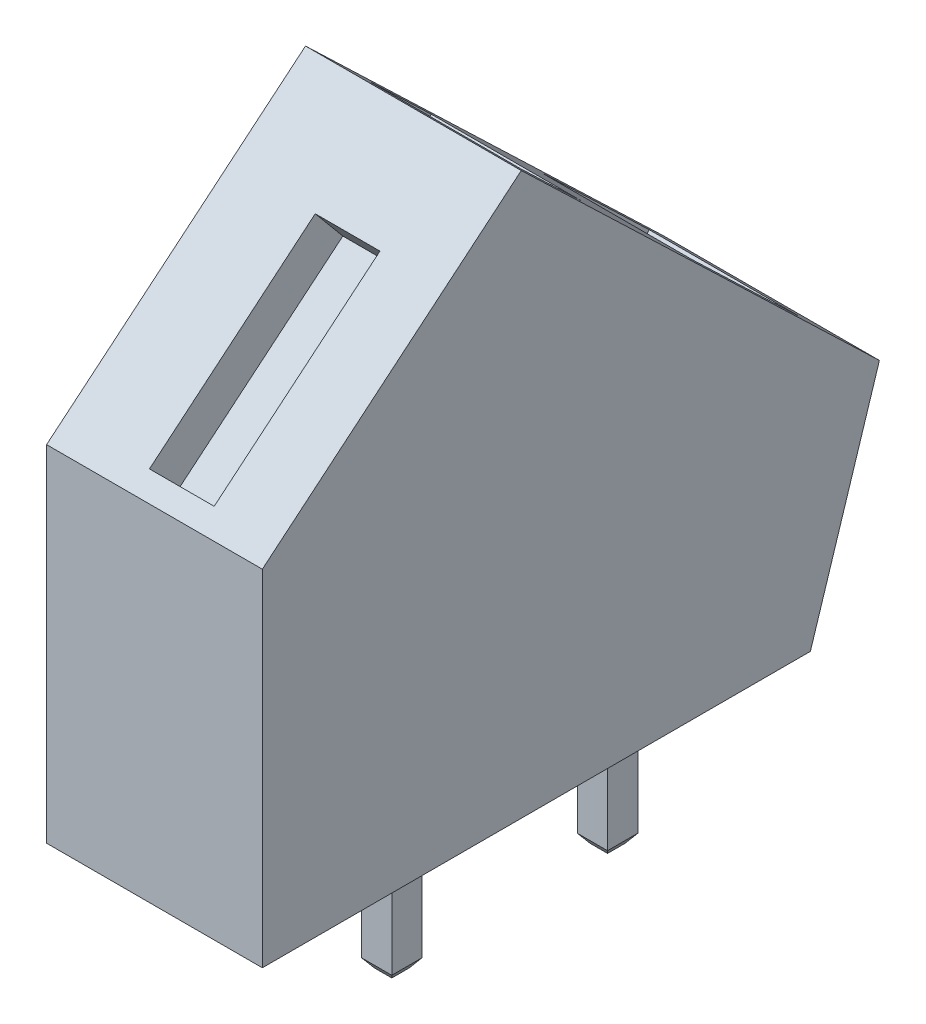
ISO-10303-21;
HEADER;
FILE_DESCRIPTION(('STEP AP214'),'2;1');
FILE_NAME('part.step','',(''),(''),'','','');
FILE_SCHEMA(('AUTOMOTIVE_DESIGN { 1 0 10303 214 1 1 1 1 }'));
ENDSEC;
DATA;
#1=APPLICATION_CONTEXT('core data for automotive mechanical design processes');
#2=APPLICATION_PROTOCOL_DEFINITION('international standard','automotive_design',2000,#1);
#3=PRODUCT_CONTEXT('',#1,'mechanical');
#4=PRODUCT('Part','Part','',(#3));
#5=PRODUCT_RELATED_PRODUCT_CATEGORY('part','',(#4));
#6=PRODUCT_DEFINITION_FORMATION('','',#4);
#7=PRODUCT_DEFINITION_CONTEXT('part definition',#1,'design');
#8=PRODUCT_DEFINITION('design','',#6,#7);
#9=PRODUCT_DEFINITION_SHAPE('','',#8);
#10=(LENGTH_UNIT() NAMED_UNIT(*) SI_UNIT(.MILLI.,.METRE.));
#11=(NAMED_UNIT(*) PLANE_ANGLE_UNIT() SI_UNIT($,.RADIAN.));
#12=(NAMED_UNIT(*) SI_UNIT($,.STERADIAN.) SOLID_ANGLE_UNIT());
#13=UNCERTAINTY_MEASURE_WITH_UNIT(LENGTH_MEASURE(1.E-05),#10,'distance_accuracy_value','');
#14=(GEOMETRIC_REPRESENTATION_CONTEXT(3) GLOBAL_UNCERTAINTY_ASSIGNED_CONTEXT((#13)) GLOBAL_UNIT_ASSIGNED_CONTEXT((#10,
#11,#12)) REPRESENTATION_CONTEXT('',''));
#15=CARTESIAN_POINT('',(0.,0.,0.));
#16=DIRECTION('',(0.,0.,1.));
#17=DIRECTION('',(1.,0.,0.));
#18=AXIS2_PLACEMENT_3D('',#15,#16,#17);
#19=CARTESIAN_POINT('',(2.5,0.,6.35));
#20=DIRECTION('',(0.,1.,0.));
#21=DIRECTION('',(0.,0.,1.));
#22=AXIS2_PLACEMENT_3D('',#19,#20,#21);
#23=PLANE('',#22);
#24=DIRECTION('',(0.,0.,-1.));
#25=VECTOR('',#24,1.);
#26=CARTESIAN_POINT('',(0.15,0.,1.7));
#27=LINE('',#26,#25);
#28=CARTESIAN_POINT('',(0.15,0.,1.7));
#29=VERTEX_POINT('',#28);
#30=CARTESIAN_POINT('',(0.15,0.,1.));
#31=VERTEX_POINT('',#30);
#32=EDGE_CURVE('E261',#29,#31,#27,.T.);
#33=ORIENTED_EDGE('',*,*,#32,.F.);
#34=DIRECTION('',(-1.,0.,0.));
#35=VECTOR('',#34,1.);
#36=CARTESIAN_POINT('',(0.85,0.,1.7));
#37=LINE('',#36,#35);
#38=CARTESIAN_POINT('',(0.85,0.,1.7));
#39=VERTEX_POINT('',#38);
#40=EDGE_CURVE('E270',#39,#29,#37,.T.);
#41=ORIENTED_EDGE('',*,*,#40,.F.);
#42=DIRECTION('',(0.,0.,1.));
#43=VECTOR('',#42,1.);
#44=CARTESIAN_POINT('',(0.85,0.,1.7));
#45=LINE('',#44,#43);
#46=CARTESIAN_POINT('',(0.85,0.,0.999999999999988));
#47=VERTEX_POINT('',#46);
#48=EDGE_CURVE('E267',#47,#39,#45,.T.);
#49=ORIENTED_EDGE('',*,*,#48,.F.);
#50=DIRECTION('',(1.,0.,0.));
#51=VECTOR('',#50,1.);
#52=CARTESIAN_POINT('',(0.85,0.,1.));
#53=LINE('',#52,#51);
#54=EDGE_CURVE('E264',#31,#47,#53,.T.);
#55=ORIENTED_EDGE('',*,*,#54,.F.);
#56=EDGE_LOOP('',(#33,#41,#49,#55));
#57=FACE_BOUND('',#56,.T.);
#58=DIRECTION('',(0.,0.,-1.));
#59=VECTOR('',#58,1.);
#60=CARTESIAN_POINT('',(-2.5,0.,6.35));
#61=LINE('',#60,#59);
#62=CARTESIAN_POINT('',(-2.5,0.,6.35));
#63=VERTEX_POINT('',#62);
#64=CARTESIAN_POINT('',(-2.5,0.,-6.35));
#65=VERTEX_POINT('',#64);
#66=EDGE_CURVE('E393',#63,#65,#61,.T.);
#67=ORIENTED_EDGE('',*,*,#66,.T.);
#68=DIRECTION('',(-1.,0.,0.));
#69=VECTOR('',#68,1.);
#70=CARTESIAN_POINT('',(2.5,0.,-6.35));
#71=LINE('',#70,#69);
#72=CARTESIAN_POINT('',(2.5,0.,-6.35));
#73=VERTEX_POINT('',#72);
#74=EDGE_CURVE('E408',#73,#65,#71,.T.);
#75=ORIENTED_EDGE('',*,*,#74,.F.);
#76=DIRECTION('',(0.,0.,-1.));
#77=VECTOR('',#76,1.);
#78=CARTESIAN_POINT('',(2.5,0.,6.35));
#79=LINE('',#78,#77);
#80=CARTESIAN_POINT('',(2.5,0.,6.35));
#81=VERTEX_POINT('',#80);
#82=EDGE_CURVE('E381',#81,#73,#79,.T.);
#83=ORIENTED_EDGE('',*,*,#82,.F.);
#84=DIRECTION('',(-1.,0.,0.));
#85=VECTOR('',#84,1.);
#86=CARTESIAN_POINT('',(2.5,0.,6.35));
#87=LINE('',#86,#85);
#88=EDGE_CURVE('E411',#81,#63,#87,.T.);
#89=ORIENTED_EDGE('',*,*,#88,.T.);
#90=EDGE_LOOP('',(#67,#75,#83,#89));
#91=FACE_BOUND('',#90,.T.);
#92=DIRECTION('',(0.,0.,-1.));
#93=VECTOR('',#92,1.);
#94=CARTESIAN_POINT('',(0.15,0.,-3.3));
#95=LINE('',#94,#93);
#96=CARTESIAN_POINT('',(0.15,0.,-3.3));
#97=VERTEX_POINT('',#96);
#98=CARTESIAN_POINT('',(0.15,0.,-4.));
#99=VERTEX_POINT('',#98);
#100=EDGE_CURVE('E231',#97,#99,#95,.T.);
#101=ORIENTED_EDGE('',*,*,#100,.F.);
#102=DIRECTION('',(-1.,0.,0.));
#103=VECTOR('',#102,1.);
#104=CARTESIAN_POINT('',(0.85,0.,-3.3));
#105=LINE('',#104,#103);
#106=CARTESIAN_POINT('',(0.85,0.,-3.3));
#107=VERTEX_POINT('',#106);
#108=EDGE_CURVE('E238',#107,#97,#105,.T.);
#109=ORIENTED_EDGE('',*,*,#108,.F.);
#110=DIRECTION('',(0.,0.,1.));
#111=VECTOR('',#110,1.);
#112=CARTESIAN_POINT('',(0.85,0.,-3.3));
#113=LINE('',#112,#111);
#114=CARTESIAN_POINT('',(0.85,0.,-4.00000000000001));
#115=VERTEX_POINT('',#114);
#116=EDGE_CURVE('E251',#115,#107,#113,.T.);
#117=ORIENTED_EDGE('',*,*,#116,.F.);
#118=DIRECTION('',(1.,0.,0.));
#119=VECTOR('',#118,1.);
#120=CARTESIAN_POINT('',(0.85,0.,-4.));
#121=LINE('',#120,#119);
#122=EDGE_CURVE('E246',#99,#115,#121,.T.);
#123=ORIENTED_EDGE('',*,*,#122,.F.);
#124=EDGE_LOOP('',(#101,#109,#117,#123));
#125=FACE_BOUND('',#124,.T.);
#126=ADVANCED_FACE('F35',(#57,#91,#125),#23,.F.);
#127=CARTESIAN_POINT('',(2.5,0.,6.35));
#128=DIRECTION('',(0.,0.,-1.));
#129=DIRECTION('',(0.,1.,0.));
#130=AXIS2_PLACEMENT_3D('',#127,#128,#129);
#131=PLANE('',#130);
#132=DIRECTION('',(0.,-1.,0.));
#133=VECTOR('',#132,1.);
#134=CARTESIAN_POINT('',(-2.5,0.,6.35));
#135=LINE('',#134,#133);
#136=CARTESIAN_POINT('',(-2.5,7.99999999999998,6.35000000000003));
#137=VERTEX_POINT('',#136);
#138=EDGE_CURVE('E341',#137,#63,#135,.T.);
#139=ORIENTED_EDGE('',*,*,#138,.T.);
#140=ORIENTED_EDGE('',*,*,#88,.F.);
#141=DIRECTION('',(0.,-1.,0.));
#142=VECTOR('',#141,1.);
#143=CARTESIAN_POINT('',(2.5,0.,6.35));
#144=LINE('',#143,#142);
#145=CARTESIAN_POINT('',(2.5,7.99999999999998,6.35000000000003));
#146=VERTEX_POINT('',#145);
#147=EDGE_CURVE('E378',#146,#81,#144,.T.);
#148=ORIENTED_EDGE('',*,*,#147,.F.);
#149=DIRECTION('',(-1.,0.,0.));
#150=VECTOR('',#149,1.);
#151=CARTESIAN_POINT('',(2.5,7.99999999999998,6.35000000000003));
#152=LINE('',#151,#150);
#153=EDGE_CURVE('E390',#146,#137,#152,.T.);
#154=ORIENTED_EDGE('',*,*,#153,.T.);
#155=EDGE_LOOP('',(#139,#140,#148,#154));
#156=FACE_BOUND('',#155,.T.);
#157=ADVANCED_FACE('F497',(#156),#131,.F.);
#158=CARTESIAN_POINT('',(2.5,5.04010050314707,-7.94999999999999));
#159=DIRECTION('',(0.,0.302573651175948,0.953126007206841));
#160=DIRECTION('',(0.,-0.953126007206841,0.302573651175948));
#161=AXIS2_PLACEMENT_3D('',#158,#159,#160);
#162=PLANE('',#161);
#163=DIRECTION('',(0.,0.953126007206841,-0.302573651175948));
#164=VECTOR('',#163,1.);
#165=CARTESIAN_POINT('',(-2.5,5.04010050314707,-7.94999999999999));
#166=LINE('',#165,#164);
#167=CARTESIAN_POINT('',(-2.5,5.04010050314707,-7.94999999999999));
#168=VERTEX_POINT('',#167);
#169=EDGE_CURVE('E395',#65,#168,#166,.T.);
#170=ORIENTED_EDGE('',*,*,#169,.T.);
#171=DIRECTION('',(-1.,0.,0.));
#172=VECTOR('',#171,1.);
#173=CARTESIAN_POINT('',(2.5,5.04010050314707,-7.94999999999999));
#174=LINE('',#173,#172);
#175=CARTESIAN_POINT('',(2.5,5.04010050314707,-7.94999999999999));
#176=VERTEX_POINT('',#175);
#177=EDGE_CURVE('E405',#176,#168,#174,.T.);
#178=ORIENTED_EDGE('',*,*,#177,.F.);
#179=DIRECTION('',(0.,0.953126007206841,-0.302573651175948));
#180=VECTOR('',#179,1.);
#181=CARTESIAN_POINT('',(2.5,5.04010050314707,-7.94999999999999));
#182=LINE('',#181,#180);
#183=EDGE_CURVE('E384',#73,#176,#182,.T.);
#184=ORIENTED_EDGE('',*,*,#183,.F.);
#185=ORIENTED_EDGE('',*,*,#74,.T.);
#186=EDGE_LOOP('',(#170,#178,#184,#185));
#187=FACE_BOUND('',#186,.T.);
#188=ADVANCED_FACE('F503',(#187),#162,.F.);
#189=CARTESIAN_POINT('',(2.5,13.,0.350000000000045));
#190=DIRECTION('',(0.,-0.721739130434785,0.692165173639385));
#191=DIRECTION('',(0.,-0.692165173639385,-0.721739130434785));
#192=AXIS2_PLACEMENT_3D('',#189,#190,#191);
#193=PLANE('',#192);
#194=DIRECTION('',(1.,0.,0.));
#195=VECTOR('',#194,1.);
#196=CARTESIAN_POINT('',(1.75,12.3078348263606,-0.371739130434742));
#197=LINE('',#196,#195);
#198=CARTESIAN_POINT('',(-1.75,12.3078348263606,-0.371739130434738));
#199=VERTEX_POINT('',#198);
#200=CARTESIAN_POINT('',(1.75,12.3078348263606,-0.371739130434742));
#201=VERTEX_POINT('',#200);
#202=EDGE_CURVE('E330',#199,#201,#197,.T.);
#203=ORIENTED_EDGE('',*,*,#202,.F.);
#204=DIRECTION('',(0.,0.692165173639385,0.721739130434785));
#205=VECTOR('',#204,1.);
#206=CARTESIAN_POINT('',(-1.75,12.3078348263606,-0.371739130434742));
#207=LINE('',#206,#205);
#208=CARTESIAN_POINT('',(-1.75,10.9235044790818,-1.81521739130431));
#209=VERTEX_POINT('',#208);
#210=EDGE_CURVE('E328',#209,#199,#207,.T.);
#211=ORIENTED_EDGE('',*,*,#210,.F.);
#212=DIRECTION('',(-1.,0.,0.));
#213=VECTOR('',#212,1.);
#214=CARTESIAN_POINT('',(1.75,10.9235044790818,-1.81521739130431));
#215=LINE('',#214,#213);
#216=CARTESIAN_POINT('',(1.75,10.9235044790818,-1.81521739130431));
#217=VERTEX_POINT('',#216);
#218=EDGE_CURVE('E318',#217,#209,#215,.T.);
#219=ORIENTED_EDGE('',*,*,#218,.F.);
#220=DIRECTION('',(0.,-0.692165173639385,-0.721739130434785));
#221=VECTOR('',#220,1.);
#222=CARTESIAN_POINT('',(1.75,12.3078348263606,-0.371739130434742));
#223=LINE('',#222,#221);
#224=EDGE_CURVE('E334',#201,#217,#223,.T.);
#225=ORIENTED_EDGE('',*,*,#224,.F.);
#226=EDGE_LOOP('',(#203,#211,#219,#225));
#227=FACE_BOUND('',#226,.T.);
#228=DIRECTION('',(-1.,0.,0.));
#229=VECTOR('',#228,1.);
#230=CARTESIAN_POINT('',(-1.75,6.07834826360615,-6.86739130434781));
#231=LINE('',#230,#229);
#232=CARTESIAN_POINT('',(1.75,6.07834826360615,-6.86739130434781));
#233=VERTEX_POINT('',#232);
#234=CARTESIAN_POINT('',(-1.75,6.07834826360615,-6.86739130434781));
#235=VERTEX_POINT('',#234);
#236=EDGE_CURVE('E363',#233,#235,#231,.T.);
#237=ORIENTED_EDGE('',*,*,#236,.F.);
#238=DIRECTION('',(0.,-0.692165173639385,-0.721739130434785));
#239=VECTOR('',#238,1.);
#240=CARTESIAN_POINT('',(1.75,6.07834826360615,-6.86739130434781));
#241=LINE('',#240,#239);
#242=CARTESIAN_POINT('',(1.75,8.500926371344,-4.34130434782606));
#243=VERTEX_POINT('',#242);
#244=EDGE_CURVE('E307',#243,#233,#241,.T.);
#245=ORIENTED_EDGE('',*,*,#244,.F.);
#246=DIRECTION('',(1.,0.,0.));
#247=VECTOR('',#246,1.);
#248=CARTESIAN_POINT('',(-1.75,8.500926371344,-4.34130434782606));
#249=LINE('',#248,#247);
#250=CARTESIAN_POINT('',(-1.75,8.500926371344,-4.34130434782606));
#251=VERTEX_POINT('',#250);
#252=EDGE_CURVE('E352',#251,#243,#249,.T.);
#253=ORIENTED_EDGE('',*,*,#252,.F.);
#254=DIRECTION('',(0.,0.692165173639385,0.721739130434785));
#255=VECTOR('',#254,1.);
#256=CARTESIAN_POINT('',(-1.75,6.07834826360615,-6.86739130434781));
#257=LINE('',#256,#255);
#258=EDGE_CURVE('E366',#235,#251,#257,.T.);
#259=ORIENTED_EDGE('',*,*,#258,.F.);
#260=EDGE_LOOP('',(#237,#245,#253,#259));
#261=FACE_BOUND('',#260,.T.);
#262=DIRECTION('',(0.,0.692165173639385,0.721739130434785));
#263=VECTOR('',#262,1.);
#264=CARTESIAN_POINT('',(-2.5,13.,0.350000000000045));
#265=LINE('',#264,#263);
#266=CARTESIAN_POINT('',(-2.5,13.,0.350000000000045));
#267=VERTEX_POINT('',#266);
#268=EDGE_CURVE('E397',#168,#267,#265,.T.);
#269=ORIENTED_EDGE('',*,*,#268,.T.);
#270=DIRECTION('',(-1.,0.,0.));
#271=VECTOR('',#270,1.);
#272=CARTESIAN_POINT('',(2.5,13.,0.350000000000045));
#273=LINE('',#272,#271);
#274=CARTESIAN_POINT('',(2.5,13.,0.350000000000045));
#275=VERTEX_POINT('',#274);
#276=EDGE_CURVE('E402',#275,#267,#273,.T.);
#277=ORIENTED_EDGE('',*,*,#276,.F.);
#278=DIRECTION('',(0.,0.692165173639385,0.721739130434785));
#279=VECTOR('',#278,1.);
#280=CARTESIAN_POINT('',(2.5,13.,0.350000000000045));
#281=LINE('',#280,#279);
#282=EDGE_CURVE('E386',#176,#275,#281,.T.);
#283=ORIENTED_EDGE('',*,*,#282,.F.);
#284=ORIENTED_EDGE('',*,*,#177,.T.);
#285=EDGE_LOOP('',(#269,#277,#283,#284));
#286=FACE_BOUND('',#285,.T.);
#287=ADVANCED_FACE('F690',(#227,#261,#286),#193,.F.);
#288=CARTESIAN_POINT('',(2.5,7.99999999999998,6.35000000000003));
#289=DIRECTION('',(0.,-0.768221279597374,-0.640184399664483));
#290=DIRECTION('',(0.,0.640184399664483,-0.768221279597374));
#291=AXIS2_PLACEMENT_3D('',#288,#289,#290);
#292=PLANE('',#291);
#293=DIRECTION('',(-1.,0.,0.));
#294=VECTOR('',#293,1.);
#295=CARTESIAN_POINT('',(-0.5,11.5210141981546,2.12478296221447));
#296=LINE('',#295,#294);
#297=CARTESIAN_POINT('',(1.,11.5210141981546,2.12478296221447));
#298=VERTEX_POINT('',#297);
#299=CARTESIAN_POINT('',(-0.5,11.5210141981546,2.12478296221447));
#300=VERTEX_POINT('',#299);
#301=EDGE_CURVE('E297',#298,#300,#296,.T.);
#302=ORIENTED_EDGE('',*,*,#301,.F.);
#303=DIRECTION('',(0.,0.640184399664483,-0.768221279597374));
#304=VECTOR('',#303,1.);
#305=CARTESIAN_POINT('',(1.,11.5210141981546,2.12478296221447));
#306=LINE('',#305,#304);
#307=CARTESIAN_POINT('',(1.,8.32009219983222,5.96588936020134));
#308=VERTEX_POINT('',#307);
#309=EDGE_CURVE('E281',#308,#298,#306,.T.);
#310=ORIENTED_EDGE('',*,*,#309,.F.);
#311=DIRECTION('',(1.,0.,0.));
#312=VECTOR('',#311,1.);
#313=CARTESIAN_POINT('',(-0.499999999999999,8.32009219983222,5.96588936020134));
#314=LINE('',#313,#312);
#315=CARTESIAN_POINT('',(-0.499999999999999,8.32009219983222,5.96588936020134));
#316=VERTEX_POINT('',#315);
#317=EDGE_CURVE('E286',#316,#308,#314,.T.);
#318=ORIENTED_EDGE('',*,*,#317,.F.);
#319=DIRECTION('',(0.,-0.640184399664483,0.768221279597374));
#320=VECTOR('',#319,1.);
#321=CARTESIAN_POINT('',(-0.5,11.5210141981546,2.12478296221447));
#322=LINE('',#321,#320);
#323=EDGE_CURVE('E300',#300,#316,#322,.T.);
#324=ORIENTED_EDGE('',*,*,#323,.F.);
#325=EDGE_LOOP('',(#302,#310,#318,#324));
#326=FACE_BOUND('',#325,.T.);
#327=DIRECTION('',(0.,-0.640184399664483,0.768221279597374));
#328=VECTOR('',#327,1.);
#329=CARTESIAN_POINT('',(-2.5,7.99999999999998,6.35000000000003));
#330=LINE('',#329,#328);
#331=EDGE_CURVE('E382',#267,#137,#330,.T.);
#332=ORIENTED_EDGE('',*,*,#331,.T.);
#333=ORIENTED_EDGE('',*,*,#153,.F.);
#334=DIRECTION('',(0.,-0.640184399664483,0.768221279597374));
#335=VECTOR('',#334,1.);
#336=CARTESIAN_POINT('',(2.5,7.99999999999998,6.35000000000003));
#337=LINE('',#336,#335);
#338=EDGE_CURVE('E388',#275,#146,#337,.T.);
#339=ORIENTED_EDGE('',*,*,#338,.F.);
#340=ORIENTED_EDGE('',*,*,#276,.T.);
#341=EDGE_LOOP('',(#332,#333,#339,#340));
#342=FACE_BOUND('',#341,.T.);
#343=ADVANCED_FACE('F684',(#326,#342),#292,.F.);
#344=CARTESIAN_POINT('',(2.5,0.,0.));
#345=DIRECTION('',(-1.,0.,0.));
#346=DIRECTION('',(0.,0.,1.));
#347=AXIS2_PLACEMENT_3D('',#344,#345,#346);
#348=PLANE('',#347);
#349=ORIENTED_EDGE('',*,*,#147,.T.);
#350=ORIENTED_EDGE('',*,*,#82,.T.);
#351=ORIENTED_EDGE('',*,*,#183,.T.);
#352=ORIENTED_EDGE('',*,*,#282,.T.);
#353=ORIENTED_EDGE('',*,*,#338,.T.);
#354=EDGE_LOOP('',(#349,#350,#351,#352,#353));
#355=FACE_BOUND('',#354,.T.);
#356=ADVANCED_FACE('F689',(#355),#348,.F.);
#357=CARTESIAN_POINT('',(-2.5,0.,0.));
#358=DIRECTION('',(-1.,0.,0.));
#359=DIRECTION('',(0.,0.,1.));
#360=AXIS2_PLACEMENT_3D('',#357,#358,#359);
#361=PLANE('',#360);
#362=ORIENTED_EDGE('',*,*,#138,.F.);
#363=ORIENTED_EDGE('',*,*,#331,.F.);
#364=ORIENTED_EDGE('',*,*,#268,.F.);
#365=ORIENTED_EDGE('',*,*,#169,.F.);
#366=ORIENTED_EDGE('',*,*,#66,.F.);
#367=EDGE_LOOP('',(#362,#363,#364,#365,#366));
#368=FACE_BOUND('',#367,.T.);
#369=ADVANCED_FACE('F793',(#368),#361,.T.);
#370=CARTESIAN_POINT('',(1.75,5.35660913317137,-6.17522613070843));
#371=DIRECTION('',(1.,0.,0.));
#372=DIRECTION('',(0.,0.,-1.));
#373=AXIS2_PLACEMENT_3D('',#370,#371,#372);
#374=PLANE('',#373);
#375=ORIENTED_EDGE('',*,*,#244,.T.);
#376=DIRECTION('',(0.,0.721739130434785,-0.692165173639385));
#377=VECTOR('',#376,1.);
#378=CARTESIAN_POINT('',(1.75,5.35660913317137,-6.17522613070843));
#379=LINE('',#378,#377);
#380=CARTESIAN_POINT('',(1.75,5.35660913317137,-6.17522613070843));
#381=VERTEX_POINT('',#380);
#382=EDGE_CURVE('E361',#381,#233,#379,.T.);
#383=ORIENTED_EDGE('',*,*,#382,.F.);
#384=DIRECTION('',(0.,-0.692165173639385,-0.721739130434785));
#385=VECTOR('',#384,1.);
#386=CARTESIAN_POINT('',(1.75,5.35660913317137,-6.17522613070843));
#387=LINE('',#386,#385);
#388=CARTESIAN_POINT('',(1.75,7.77918724090921,-3.64913917418668));
#389=VERTEX_POINT('',#388);
#390=EDGE_CURVE('E348',#389,#381,#387,.T.);
#391=ORIENTED_EDGE('',*,*,#390,.F.);
#392=DIRECTION('',(0.,0.721739130434785,-0.692165173639385));
#393=VECTOR('',#392,1.);
#394=CARTESIAN_POINT('',(1.75,7.77918724090921,-3.64913917418668));
#395=LINE('',#394,#393);
#396=EDGE_CURVE('E331',#389,#243,#395,.T.);
#397=ORIENTED_EDGE('',*,*,#396,.T.);
#398=EDGE_LOOP('',(#375,#383,#391,#397));
#399=FACE_BOUND('',#398,.T.);
#400=ADVANCED_FACE('F783',(#399),#374,.F.);
#401=CARTESIAN_POINT('',(-1.75,7.77918724090921,-3.64913917418668));
#402=DIRECTION('',(0.,0.692165173639385,0.721739130434785));
#403=DIRECTION('',(0.,-0.721739130434785,0.692165173639385));
#404=AXIS2_PLACEMENT_3D('',#401,#402,#403);
#405=PLANE('',#404);
#406=ORIENTED_EDGE('',*,*,#252,.T.);
#407=ORIENTED_EDGE('',*,*,#396,.F.);
#408=DIRECTION('',(1.,0.,0.));
#409=VECTOR('',#408,1.);
#410=CARTESIAN_POINT('',(-1.75,7.77918724090921,-3.64913917418668));
#411=LINE('',#410,#409);
#412=CARTESIAN_POINT('',(-1.75,7.77918724090921,-3.64913917418668));
#413=VERTEX_POINT('',#412);
#414=EDGE_CURVE('E358',#413,#389,#411,.T.);
#415=ORIENTED_EDGE('',*,*,#414,.F.);
#416=DIRECTION('',(0.,0.721739130434785,-0.692165173639385));
#417=VECTOR('',#416,1.);
#418=CARTESIAN_POINT('',(-1.75,7.77918724090921,-3.64913917418668));
#419=LINE('',#418,#417);
#420=EDGE_CURVE('E372',#413,#251,#419,.T.);
#421=ORIENTED_EDGE('',*,*,#420,.T.);
#422=EDGE_LOOP('',(#406,#407,#415,#421));
#423=FACE_BOUND('',#422,.T.);
#424=ADVANCED_FACE('F773',(#423),#405,.F.);
#425=CARTESIAN_POINT('',(-1.75,5.35660913317137,-6.17522613070843));
#426=DIRECTION('',(-1.,0.,0.));
#427=DIRECTION('',(0.,0.,1.));
#428=AXIS2_PLACEMENT_3D('',#425,#426,#427);
#429=PLANE('',#428);
#430=ORIENTED_EDGE('',*,*,#258,.T.);
#431=ORIENTED_EDGE('',*,*,#420,.F.);
#432=DIRECTION('',(0.,0.692165173639385,0.721739130434785));
#433=VECTOR('',#432,1.);
#434=CARTESIAN_POINT('',(-1.75,5.35660913317137,-6.17522613070843));
#435=LINE('',#434,#433);
#436=CARTESIAN_POINT('',(-1.75,5.35660913317137,-6.17522613070843));
#437=VERTEX_POINT('',#436);
#438=EDGE_CURVE('E355',#437,#413,#435,.T.);
#439=ORIENTED_EDGE('',*,*,#438,.F.);
#440=DIRECTION('',(0.,0.721739130434785,-0.692165173639385));
#441=VECTOR('',#440,1.);
#442=CARTESIAN_POINT('',(-1.75,5.35660913317137,-6.17522613070843));
#443=LINE('',#442,#441);
#444=EDGE_CURVE('E374',#437,#235,#443,.T.);
#445=ORIENTED_EDGE('',*,*,#444,.T.);
#446=EDGE_LOOP('',(#430,#431,#439,#445));
#447=FACE_BOUND('',#446,.T.);
#448=ADVANCED_FACE('F763',(#447),#429,.F.);
#449=CARTESIAN_POINT('',(-1.75,5.35660913317137,-6.17522613070843));
#450=DIRECTION('',(0.,-0.692165173639385,-0.721739130434785));
#451=DIRECTION('',(0.,0.721739130434785,-0.692165173639385));
#452=AXIS2_PLACEMENT_3D('',#449,#450,#451);
#453=PLANE('',#452);
#454=ORIENTED_EDGE('',*,*,#236,.T.);
#455=ORIENTED_EDGE('',*,*,#444,.F.);
#456=DIRECTION('',(-1.,0.,0.));
#457=VECTOR('',#456,1.);
#458=CARTESIAN_POINT('',(-1.75,5.35660913317137,-6.17522613070843));
#459=LINE('',#458,#457);
#460=EDGE_CURVE('E351',#381,#437,#459,.T.);
#461=ORIENTED_EDGE('',*,*,#460,.F.);
#462=ORIENTED_EDGE('',*,*,#382,.T.);
#463=EDGE_LOOP('',(#454,#455,#461,#462));
#464=FACE_BOUND('',#463,.T.);
#465=ADVANCED_FACE('F753',(#464),#453,.F.);
#466=CARTESIAN_POINT('',(0.,5.87520976908617,-5.63446738371738));
#467=DIRECTION('',(0.,0.721739130434785,-0.692165173639385));
#468=DIRECTION('',(0.,0.692165173639385,0.721739130434785));
#469=AXIS2_PLACEMENT_3D('',#466,#467,#468);
#470=PLANE('',#469);
#471=ORIENTED_EDGE('',*,*,#390,.T.);
#472=ORIENTED_EDGE('',*,*,#460,.T.);
#473=ORIENTED_EDGE('',*,*,#438,.T.);
#474=ORIENTED_EDGE('',*,*,#414,.T.);
#475=EDGE_LOOP('',(#471,#472,#473,#474));
#476=FACE_BOUND('',#475,.T.);
#477=ADVANCED_FACE('F743',(#476),#470,.T.);
#478=CARTESIAN_POINT('',(-1.75,11.5860956959258,0.320426043204643));
#479=DIRECTION('',(-1.,0.,0.));
#480=DIRECTION('',(0.,0.,1.));
#481=AXIS2_PLACEMENT_3D('',#478,#479,#480);
#482=PLANE('',#481);
#483=ORIENTED_EDGE('',*,*,#210,.T.);
#484=DIRECTION('',(0.,0.721739130434785,-0.692165173639385));
#485=VECTOR('',#484,1.);
#486=CARTESIAN_POINT('',(-1.75,11.5860956959258,0.320426043204643));
#487=LINE('',#486,#485);
#488=CARTESIAN_POINT('',(-1.75,11.5860956959258,0.320426043204643));
#489=VERTEX_POINT('',#488);
#490=EDGE_CURVE('E327',#489,#199,#487,.T.);
#491=ORIENTED_EDGE('',*,*,#490,.F.);
#492=DIRECTION('',(0.,0.692165173639385,0.721739130434785));
#493=VECTOR('',#492,1.);
#494=CARTESIAN_POINT('',(-1.75,11.5860956959258,0.320426043204643));
#495=LINE('',#494,#493);
#496=CARTESIAN_POINT('',(-1.75,10.2017653486471,-1.12305221766493));
#497=VERTEX_POINT('',#496);
#498=EDGE_CURVE('E314',#497,#489,#495,.T.);
#499=ORIENTED_EDGE('',*,*,#498,.F.);
#500=DIRECTION('',(0.,0.721739130434785,-0.692165173639385));
#501=VECTOR('',#500,1.);
#502=CARTESIAN_POINT('',(-1.75,10.2017653486471,-1.12305221766493));
#503=LINE('',#502,#501);
#504=EDGE_CURVE('E339',#497,#209,#503,.T.);
#505=ORIENTED_EDGE('',*,*,#504,.T.);
#506=EDGE_LOOP('',(#483,#491,#499,#505));
#507=FACE_BOUND('',#506,.T.);
#508=ADVANCED_FACE('F733',(#507),#482,.F.);
#509=CARTESIAN_POINT('',(1.75,10.2017653486471,-1.12305221766493));
#510=DIRECTION('',(0.,-0.692165173639385,-0.721739130434785));
#511=DIRECTION('',(0.,0.721739130434785,-0.692165173639385));
#512=AXIS2_PLACEMENT_3D('',#509,#510,#511);
#513=PLANE('',#512);
#514=ORIENTED_EDGE('',*,*,#218,.T.);
#515=ORIENTED_EDGE('',*,*,#504,.F.);
#516=DIRECTION('',(-1.,0.,0.));
#517=VECTOR('',#516,1.);
#518=CARTESIAN_POINT('',(1.75,10.2017653486471,-1.12305221766493));
#519=LINE('',#518,#517);
#520=CARTESIAN_POINT('',(1.75,10.2017653486471,-1.12305221766493));
#521=VERTEX_POINT('',#520);
#522=EDGE_CURVE('E324',#521,#497,#519,.T.);
#523=ORIENTED_EDGE('',*,*,#522,.F.);
#524=DIRECTION('',(0.,0.721739130434785,-0.692165173639385));
#525=VECTOR('',#524,1.);
#526=CARTESIAN_POINT('',(1.75,10.2017653486471,-1.12305221766493));
#527=LINE('',#526,#525);
#528=EDGE_CURVE('E342',#521,#217,#527,.T.);
#529=ORIENTED_EDGE('',*,*,#528,.T.);
#530=EDGE_LOOP('',(#514,#515,#523,#529));
#531=FACE_BOUND('',#530,.T.);
#532=ADVANCED_FACE('F723',(#531),#513,.F.);
#533=CARTESIAN_POINT('',(1.75,11.5860956959258,0.320426043204643));
#534=DIRECTION('',(1.,0.,0.));
#535=DIRECTION('',(0.,0.,-1.));
#536=AXIS2_PLACEMENT_3D('',#533,#534,#535);
#537=PLANE('',#536);
#538=ORIENTED_EDGE('',*,*,#224,.T.);
#539=ORIENTED_EDGE('',*,*,#528,.F.);
#540=DIRECTION('',(0.,-0.692165173639385,-0.721739130434785));
#541=VECTOR('',#540,1.);
#542=CARTESIAN_POINT('',(1.75,11.5860956959258,0.320426043204643));
#543=LINE('',#542,#541);
#544=CARTESIAN_POINT('',(1.75,11.5860956959258,0.320426043204643));
#545=VERTEX_POINT('',#544);
#546=EDGE_CURVE('E321',#545,#521,#543,.T.);
#547=ORIENTED_EDGE('',*,*,#546,.F.);
#548=DIRECTION('',(0.,0.721739130434785,-0.692165173639385));
#549=VECTOR('',#548,1.);
#550=CARTESIAN_POINT('',(1.75,11.5860956959258,0.320426043204643));
#551=LINE('',#550,#549);
#552=EDGE_CURVE('E344',#545,#201,#551,.T.);
#553=ORIENTED_EDGE('',*,*,#552,.T.);
#554=EDGE_LOOP('',(#538,#539,#547,#553));
#555=FACE_BOUND('',#554,.T.);
#556=ADVANCED_FACE('F713',(#555),#537,.F.);
#557=CARTESIAN_POINT('',(1.75,11.5860956959258,0.320426043204643));
#558=DIRECTION('',(0.,0.692165173639385,0.721739130434785));
#559=DIRECTION('',(0.,-0.721739130434785,0.692165173639385));
#560=AXIS2_PLACEMENT_3D('',#557,#558,#559);
#561=PLANE('',#560);
#562=ORIENTED_EDGE('',*,*,#202,.T.);
#563=ORIENTED_EDGE('',*,*,#552,.F.);
#564=DIRECTION('',(1.,0.,0.));
#565=VECTOR('',#564,1.);
#566=CARTESIAN_POINT('',(1.75,11.5860956959258,0.320426043204643));
#567=LINE('',#566,#565);
#568=EDGE_CURVE('E317',#489,#545,#567,.T.);
#569=ORIENTED_EDGE('',*,*,#568,.F.);
#570=ORIENTED_EDGE('',*,*,#490,.T.);
#571=EDGE_LOOP('',(#562,#563,#569,#570));
#572=FACE_BOUND('',#571,.T.);
#573=ADVANCED_FACE('F703',(#572),#561,.F.);
#574=CARTESIAN_POINT('',(0.,5.87520976908617,-5.63446738371738));
#575=DIRECTION('',(0.,0.721739130434785,-0.692165173639385));
#576=DIRECTION('',(0.,0.692165173639385,0.721739130434785));
#577=AXIS2_PLACEMENT_3D('',#574,#575,#576);
#578=PLANE('',#577);
#579=ORIENTED_EDGE('',*,*,#498,.T.);
#580=ORIENTED_EDGE('',*,*,#568,.T.);
#581=ORIENTED_EDGE('',*,*,#546,.T.);
#582=ORIENTED_EDGE('',*,*,#522,.T.);
#583=EDGE_LOOP('',(#579,#580,#581,#582));
#584=FACE_BOUND('',#583,.T.);
#585=ADVANCED_FACE('F676',(#584),#578,.T.);
#586=CARTESIAN_POINT('',(1.,10.7527929185573,1.48459856254999));
#587=DIRECTION('',(1.,0.,0.));
#588=DIRECTION('',(0.,0.,-1.));
#589=AXIS2_PLACEMENT_3D('',#586,#587,#588);
#590=PLANE('',#589);
#591=ORIENTED_EDGE('',*,*,#309,.T.);
#592=DIRECTION('',(0.,0.768221279597374,0.640184399664483));
#593=VECTOR('',#592,1.);
#594=CARTESIAN_POINT('',(1.,10.7527929185573,1.48459856254999));
#595=LINE('',#594,#593);
#596=CARTESIAN_POINT('',(1.,10.7527929185573,1.48459856254999));
#597=VERTEX_POINT('',#596);
#598=EDGE_CURVE('E295',#597,#298,#595,.T.);
#599=ORIENTED_EDGE('',*,*,#598,.F.);
#600=DIRECTION('',(0.,0.640184399664483,-0.768221279597374));
#601=VECTOR('',#600,1.);
#602=CARTESIAN_POINT('',(1.,10.7527929185573,1.48459856254999));
#603=LINE('',#602,#601);
#604=CARTESIAN_POINT('',(1.,7.55187092023485,5.32570496053686));
#605=VERTEX_POINT('',#604);
#606=EDGE_CURVE('E282',#605,#597,#603,.T.);
#607=ORIENTED_EDGE('',*,*,#606,.F.);
#608=DIRECTION('',(0.,0.768221279597374,0.640184399664483));
#609=VECTOR('',#608,1.);
#610=CARTESIAN_POINT('',(1.,7.55187092023485,5.32570496053686));
#611=LINE('',#610,#609);
#612=EDGE_CURVE('E305',#605,#308,#611,.T.);
#613=ORIENTED_EDGE('',*,*,#612,.T.);
#614=EDGE_LOOP('',(#591,#599,#607,#613));
#615=FACE_BOUND('',#614,.T.);
#616=ADVANCED_FACE('F666',(#615),#590,.F.);
#617=CARTESIAN_POINT('',(-0.499999999999999,7.55187092023485,5.32570496053686));
#618=DIRECTION('',(0.,-0.640184399664483,0.768221279597374));
#619=DIRECTION('',(0.,-0.768221279597374,-0.640184399664483));
#620=AXIS2_PLACEMENT_3D('',#617,#618,#619);
#621=PLANE('',#620);
#622=ORIENTED_EDGE('',*,*,#317,.T.);
#623=ORIENTED_EDGE('',*,*,#612,.F.);
#624=DIRECTION('',(1.,0.,0.));
#625=VECTOR('',#624,1.);
#626=CARTESIAN_POINT('',(-0.499999999999999,7.55187092023485,5.32570496053686));
#627=LINE('',#626,#625);
#628=CARTESIAN_POINT('',(-0.499999999999999,7.55187092023485,5.32570496053686));
#629=VERTEX_POINT('',#628);
#630=EDGE_CURVE('E292',#629,#605,#627,.T.);
#631=ORIENTED_EDGE('',*,*,#630,.F.);
#632=DIRECTION('',(0.,0.768221279597374,0.640184399664483));
#633=VECTOR('',#632,1.);
#634=CARTESIAN_POINT('',(-0.499999999999999,7.55187092023485,5.32570496053686));
#635=LINE('',#634,#633);
#636=EDGE_CURVE('E308',#629,#316,#635,.T.);
#637=ORIENTED_EDGE('',*,*,#636,.T.);
#638=EDGE_LOOP('',(#622,#623,#631,#637));
#639=FACE_BOUND('',#638,.T.);
#640=ADVANCED_FACE('F656',(#639),#621,.F.);
#641=CARTESIAN_POINT('',(-0.5,10.7527929185573,1.48459856254999));
#642=DIRECTION('',(-1.,0.,0.));
#643=DIRECTION('',(0.,0.,1.));
#644=AXIS2_PLACEMENT_3D('',#641,#642,#643);
#645=PLANE('',#644);
#646=ORIENTED_EDGE('',*,*,#323,.T.);
#647=ORIENTED_EDGE('',*,*,#636,.F.);
#648=DIRECTION('',(0.,-0.640184399664483,0.768221279597374));
#649=VECTOR('',#648,1.);
#650=CARTESIAN_POINT('',(-0.5,10.7527929185573,1.48459856254999));
#651=LINE('',#650,#649);
#652=CARTESIAN_POINT('',(-0.5,10.7527929185573,1.48459856254999));
#653=VERTEX_POINT('',#652);
#654=EDGE_CURVE('E289',#653,#629,#651,.T.);
#655=ORIENTED_EDGE('',*,*,#654,.F.);
#656=DIRECTION('',(0.,0.768221279597374,0.640184399664483));
#657=VECTOR('',#656,1.);
#658=CARTESIAN_POINT('',(-0.5,10.7527929185573,1.48459856254999));
#659=LINE('',#658,#657);
#660=EDGE_CURVE('E310',#653,#300,#659,.T.);
#661=ORIENTED_EDGE('',*,*,#660,.T.);
#662=EDGE_LOOP('',(#646,#647,#655,#661));
#663=FACE_BOUND('',#662,.T.);
#664=ADVANCED_FACE('F646',(#663),#645,.F.);
#665=CARTESIAN_POINT('',(-0.5,10.7527929185573,1.48459856254999));
#666=DIRECTION('',(0.,0.640184399664483,-0.768221279597374));
#667=DIRECTION('',(0.,0.768221279597374,0.640184399664483));
#668=AXIS2_PLACEMENT_3D('',#665,#666,#667);
#669=PLANE('',#668);
#670=ORIENTED_EDGE('',*,*,#301,.T.);
#671=ORIENTED_EDGE('',*,*,#660,.F.);
#672=DIRECTION('',(-1.,0.,0.));
#673=VECTOR('',#672,1.);
#674=CARTESIAN_POINT('',(-0.5,10.7527929185573,1.48459856254999));
#675=LINE('',#674,#673);
#676=EDGE_CURVE('E285',#597,#653,#675,.T.);
#677=ORIENTED_EDGE('',*,*,#676,.F.);
#678=ORIENTED_EDGE('',*,*,#598,.T.);
#679=EDGE_LOOP('',(#670,#671,#677,#678));
#680=FACE_BOUND('',#679,.T.);
#681=ADVANCED_FACE('F635',(#680),#669,.F.);
#682=CARTESIAN_POINT('',(0.,7.07604101548457,5.89670084623719));
#683=DIRECTION('',(0.,0.768221279597374,0.640184399664483));
#684=DIRECTION('',(0.,-0.640184399664483,0.768221279597374));
#685=AXIS2_PLACEMENT_3D('',#682,#683,#684);
#686=PLANE('',#685);
#687=ORIENTED_EDGE('',*,*,#606,.T.);
#688=ORIENTED_EDGE('',*,*,#676,.T.);
#689=ORIENTED_EDGE('',*,*,#654,.T.);
#690=ORIENTED_EDGE('',*,*,#630,.T.);
#691=EDGE_LOOP('',(#687,#688,#689,#690));
#692=FACE_BOUND('',#691,.T.);
#693=ADVANCED_FACE('F620',(#692),#686,.T.);
#694=CARTESIAN_POINT('',(0.15,-3.50000000000001,1.69999999999999));
#695=DIRECTION('',(1.,0.,0.));
#696=DIRECTION('',(0.,0.,-1.));
#697=AXIS2_PLACEMENT_3D('',#694,#695,#696);
#698=PLANE('',#697);
#699=DIRECTION('',(0.,1.,0.));
#700=VECTOR('',#699,1.);
#701=CARTESIAN_POINT('',(0.15,-3.5,0.999999999999988));
#702=LINE('',#701,#700);
#703=CARTESIAN_POINT('',(0.15,-3.30000000000001,0.999999999999989));
#704=VERTEX_POINT('',#703);
#705=EDGE_CURVE('E279',#704,#31,#702,.T.);
#706=ORIENTED_EDGE('',*,*,#705,.F.);
#707=DIRECTION('',(0.,0.,1.));
#708=VECTOR('',#707,1.);
#709=CARTESIAN_POINT('',(0.15,-3.30000000000001,1.69999999999999));
#710=LINE('',#709,#708);
#711=CARTESIAN_POINT('',(0.15,-3.30000000000001,1.69999999999999));
#712=VERTEX_POINT('',#711);
#713=EDGE_CURVE('E59',#704,#712,#710,.T.);
#714=ORIENTED_EDGE('',*,*,#713,.T.);
#715=DIRECTION('',(0.,1.,0.));
#716=VECTOR('',#715,1.);
#717=CARTESIAN_POINT('',(0.15,-3.50000000000001,1.69999999999999));
#718=LINE('',#717,#716);
#719=EDGE_CURVE('E273',#712,#29,#718,.T.);
#720=ORIENTED_EDGE('',*,*,#719,.T.);
#721=ORIENTED_EDGE('',*,*,#32,.T.);
#722=EDGE_LOOP('',(#706,#714,#720,#721));
#723=FACE_BOUND('',#722,.T.);
#724=ADVANCED_FACE('F612',(#723),#698,.F.);
#725=CARTESIAN_POINT('',(0.85,-3.5,0.999999999999988));
#726=DIRECTION('',(0.,0.,1.));
#727=DIRECTION('',(0.,-1.,0.));
#728=AXIS2_PLACEMENT_3D('',#725,#726,#727);
#729=PLANE('',#728);
#730=DIRECTION('',(0.,1.,0.));
#731=VECTOR('',#730,1.);
#732=CARTESIAN_POINT('',(0.85,-3.5,0.999999999999988));
#733=LINE('',#732,#731);
#734=CARTESIAN_POINT('',(0.85,-3.30000000000001,0.999999999999989));
#735=VERTEX_POINT('',#734);
#736=EDGE_CURVE('E277',#735,#47,#733,.T.);
#737=ORIENTED_EDGE('',*,*,#736,.F.);
#738=DIRECTION('',(-1.,0.,0.));
#739=VECTOR('',#738,1.);
#740=CARTESIAN_POINT('',(0.85,-3.3,0.999999999999989));
#741=LINE('',#740,#739);
#742=EDGE_CURVE('E440',#735,#704,#741,.T.);
#743=ORIENTED_EDGE('',*,*,#742,.T.);
#744=ORIENTED_EDGE('',*,*,#705,.T.);
#745=ORIENTED_EDGE('',*,*,#54,.T.);
#746=EDGE_LOOP('',(#737,#743,#744,#745));
#747=FACE_BOUND('',#746,.T.);
#748=ADVANCED_FACE('F479',(#747),#729,.F.);
#749=CARTESIAN_POINT('',(0.85,-3.50000000000001,1.69999999999999));
#750=DIRECTION('',(-1.,0.,0.));
#751=DIRECTION('',(0.,0.,1.));
#752=AXIS2_PLACEMENT_3D('',#749,#750,#751);
#753=PLANE('',#752);
#754=DIRECTION('',(0.,1.,0.));
#755=VECTOR('',#754,1.);
#756=CARTESIAN_POINT('',(0.85,-3.50000000000001,1.69999999999999));
#757=LINE('',#756,#755);
#758=CARTESIAN_POINT('',(0.85,-3.30000000000001,1.69999999999999));
#759=VERTEX_POINT('',#758);
#760=EDGE_CURVE('E275',#759,#39,#757,.T.);
#761=ORIENTED_EDGE('',*,*,#760,.F.);
#762=DIRECTION('',(0.,0.,-1.));
#763=VECTOR('',#762,1.);
#764=CARTESIAN_POINT('',(0.85,-3.30000000000001,1.69999999999999));
#765=LINE('',#764,#763);
#766=EDGE_CURVE('E11',#759,#735,#765,.T.);
#767=ORIENTED_EDGE('',*,*,#766,.T.);
#768=ORIENTED_EDGE('',*,*,#736,.T.);
#769=ORIENTED_EDGE('',*,*,#48,.T.);
#770=EDGE_LOOP('',(#761,#767,#768,#769));
#771=FACE_BOUND('',#770,.T.);
#772=ADVANCED_FACE('F475',(#771),#753,.F.);
#773=CARTESIAN_POINT('',(0.85,-3.50000000000001,1.69999999999999));
#774=DIRECTION('',(0.,0.,-1.));
#775=DIRECTION('',(0.,1.,0.));
#776=AXIS2_PLACEMENT_3D('',#773,#774,#775);
#777=PLANE('',#776);
#778=ORIENTED_EDGE('',*,*,#719,.F.);
#779=DIRECTION('',(1.,0.,0.));
#780=VECTOR('',#779,1.);
#781=CARTESIAN_POINT('',(0.85,-3.30000000000001,1.69999999999999));
#782=LINE('',#781,#780);
#783=EDGE_CURVE('E44',#712,#759,#782,.T.);
#784=ORIENTED_EDGE('',*,*,#783,.T.);
#785=ORIENTED_EDGE('',*,*,#760,.T.);
#786=ORIENTED_EDGE('',*,*,#40,.T.);
#787=EDGE_LOOP('',(#778,#784,#785,#786));
#788=FACE_BOUND('',#787,.T.);
#789=ADVANCED_FACE('F487',(#788),#777,.F.);
#790=CARTESIAN_POINT('',(0.,-3.5,0.));
#791=DIRECTION('',(0.,1.,0.));
#792=DIRECTION('',(0.,0.,1.));
#793=AXIS2_PLACEMENT_3D('',#790,#791,#792);
#794=PLANE('',#793);
#795=DIRECTION('',(0.,0.,-1.));
#796=VECTOR('',#795,1.);
#797=CARTESIAN_POINT('',(0.29530850560107,-3.5,0.));
#798=LINE('',#797,#796);
#799=CARTESIAN_POINT('',(0.29530850560107,-3.50000000000001,1.55469149439892));
#800=VERTEX_POINT('',#799);
#801=CARTESIAN_POINT('',(0.29530850560107,-3.5,1.14530850560106));
#802=VERTEX_POINT('',#801);
#803=EDGE_CURVE('E435',#800,#802,#798,.T.);
#804=ORIENTED_EDGE('',*,*,#803,.T.);
#805=DIRECTION('',(1.,0.,0.));
#806=VECTOR('',#805,1.);
#807=CARTESIAN_POINT('',(0.,-3.5,1.14530850560106));
#808=LINE('',#807,#806);
#809=CARTESIAN_POINT('',(0.70469149439893,-3.5,1.14530850560106));
#810=VERTEX_POINT('',#809);
#811=EDGE_CURVE('E437',#802,#810,#808,.T.);
#812=ORIENTED_EDGE('',*,*,#811,.T.);
#813=DIRECTION('',(0.,0.,1.));
#814=VECTOR('',#813,1.);
#815=CARTESIAN_POINT('',(0.704691494398931,-3.5,0.));
#816=LINE('',#815,#814);
#817=CARTESIAN_POINT('',(0.70469149439893,-3.50000000000001,1.55469149439892));
#818=VERTEX_POINT('',#817);
#819=EDGE_CURVE('E431',#810,#818,#816,.T.);
#820=ORIENTED_EDGE('',*,*,#819,.T.);
#821=DIRECTION('',(-1.,0.,0.));
#822=VECTOR('',#821,1.);
#823=CARTESIAN_POINT('',(0.,-3.50000000000001,1.55469149439892));
#824=LINE('',#823,#822);
#825=EDGE_CURVE('E433',#818,#800,#824,.T.);
#826=ORIENTED_EDGE('',*,*,#825,.T.);
#827=EDGE_LOOP('',(#804,#812,#820,#826));
#828=FACE_BOUND('',#827,.T.);
#829=ADVANCED_FACE('F485',(#828),#794,.F.);
#830=CARTESIAN_POINT('',(0.15,-3.49999999999999,-3.30000000000001));
#831=DIRECTION('',(1.,0.,0.));
#832=DIRECTION('',(0.,0.,-1.));
#833=AXIS2_PLACEMENT_3D('',#830,#831,#832);
#834=PLANE('',#833);
#835=DIRECTION('',(0.,1.,0.));
#836=VECTOR('',#835,1.);
#837=CARTESIAN_POINT('',(0.15,-3.49999999999999,-4.00000000000001));
#838=LINE('',#837,#836);
#839=CARTESIAN_POINT('',(0.15,-3.29999999999999,-4.00000000000001));
#840=VERTEX_POINT('',#839);
#841=EDGE_CURVE('E259',#840,#99,#838,.T.);
#842=ORIENTED_EDGE('',*,*,#841,.F.);
#843=DIRECTION('',(0.,0.,1.));
#844=VECTOR('',#843,1.);
#845=CARTESIAN_POINT('',(0.15,-3.29999999999999,-3.30000000000001));
#846=LINE('',#845,#844);
#847=CARTESIAN_POINT('',(0.15,-3.29999999999999,-3.30000000000001));
#848=VERTEX_POINT('',#847);
#849=EDGE_CURVE('E233',#840,#848,#846,.T.);
#850=ORIENTED_EDGE('',*,*,#849,.T.);
#851=DIRECTION('',(0.,1.,0.));
#852=VECTOR('',#851,1.);
#853=CARTESIAN_POINT('',(0.15,-3.49999999999999,-3.30000000000001));
#854=LINE('',#853,#852);
#855=EDGE_CURVE('E227',#848,#97,#854,.T.);
#856=ORIENTED_EDGE('',*,*,#855,.T.);
#857=ORIENTED_EDGE('',*,*,#100,.T.);
#858=EDGE_LOOP('',(#842,#850,#856,#857));
#859=FACE_BOUND('',#858,.T.);
#860=ADVANCED_FACE('F230',(#859),#834,.F.);
#861=CARTESIAN_POINT('',(0.85,-3.49999999999999,-4.00000000000001));
#862=DIRECTION('',(0.,0.,1.));
#863=DIRECTION('',(0.,-1.,0.));
#864=AXIS2_PLACEMENT_3D('',#861,#862,#863);
#865=PLANE('',#864);
#866=DIRECTION('',(0.,1.,0.));
#867=VECTOR('',#866,1.);
#868=CARTESIAN_POINT('',(0.85,-3.49999999999999,-4.00000000000001));
#869=LINE('',#868,#867);
#870=CARTESIAN_POINT('',(0.85,-3.29999999999999,-4.00000000000001));
#871=VERTEX_POINT('',#870);
#872=EDGE_CURVE('E257',#871,#115,#869,.T.);
#873=ORIENTED_EDGE('',*,*,#872,.F.);
#874=DIRECTION('',(-1.,0.,0.));
#875=VECTOR('',#874,1.);
#876=CARTESIAN_POINT('',(0.85,-3.29999999999999,-4.00000000000001));
#877=LINE('',#876,#875);
#878=EDGE_CURVE('E423',#871,#840,#877,.T.);
#879=ORIENTED_EDGE('',*,*,#878,.T.);
#880=ORIENTED_EDGE('',*,*,#841,.T.);
#881=ORIENTED_EDGE('',*,*,#122,.T.);
#882=EDGE_LOOP('',(#873,#879,#880,#881));
#883=FACE_BOUND('',#882,.T.);
#884=ADVANCED_FACE('F493',(#883),#865,.F.);
#885=CARTESIAN_POINT('',(0.85,-3.49999999999999,-3.30000000000001));
#886=DIRECTION('',(-1.,0.,0.));
#887=DIRECTION('',(0.,0.,1.));
#888=AXIS2_PLACEMENT_3D('',#885,#886,#887);
#889=PLANE('',#888);
#890=DIRECTION('',(0.,1.,0.));
#891=VECTOR('',#890,1.);
#892=CARTESIAN_POINT('',(0.85,-3.49999999999999,-3.30000000000001));
#893=LINE('',#892,#891);
#894=CARTESIAN_POINT('',(0.85,-3.29999999999999,-3.30000000000001));
#895=VERTEX_POINT('',#894);
#896=EDGE_CURVE('E237',#895,#107,#893,.T.);
#897=ORIENTED_EDGE('',*,*,#896,.F.);
#898=DIRECTION('',(0.,0.,-1.));
#899=VECTOR('',#898,1.);
#900=CARTESIAN_POINT('',(0.85,-3.29999999999999,-3.30000000000001));
#901=LINE('',#900,#899);
#902=EDGE_CURVE('E426',#895,#871,#901,.T.);
#903=ORIENTED_EDGE('',*,*,#902,.T.);
#904=ORIENTED_EDGE('',*,*,#872,.T.);
#905=ORIENTED_EDGE('',*,*,#116,.T.);
#906=EDGE_LOOP('',(#897,#903,#904,#905));
#907=FACE_BOUND('',#906,.T.);
#908=ADVANCED_FACE('F566',(#907),#889,.F.);
#909=CARTESIAN_POINT('',(0.85,-3.49999999999999,-3.30000000000001));
#910=DIRECTION('',(0.,0.,-1.));
#911=DIRECTION('',(0.,1.,0.));
#912=AXIS2_PLACEMENT_3D('',#909,#910,#911);
#913=PLANE('',#912);
#914=ORIENTED_EDGE('',*,*,#855,.F.);
#915=DIRECTION('',(1.,0.,0.));
#916=VECTOR('',#915,1.);
#917=CARTESIAN_POINT('',(0.85,-3.29999999999999,-3.30000000000001));
#918=LINE('',#917,#916);
#919=EDGE_CURVE('E428',#848,#895,#918,.T.);
#920=ORIENTED_EDGE('',*,*,#919,.T.);
#921=ORIENTED_EDGE('',*,*,#896,.T.);
#922=ORIENTED_EDGE('',*,*,#108,.T.);
#923=EDGE_LOOP('',(#914,#920,#921,#922));
#924=FACE_BOUND('',#923,.T.);
#925=ADVANCED_FACE('F249',(#924),#913,.F.);
#926=CARTESIAN_POINT('',(0.,-3.5,0.));
#927=DIRECTION('',(0.,1.,0.));
#928=DIRECTION('',(0.,0.,1.));
#929=AXIS2_PLACEMENT_3D('',#926,#927,#928);
#930=PLANE('',#929);
#931=DIRECTION('',(0.,0.,-1.));
#932=VECTOR('',#931,1.);
#933=CARTESIAN_POINT('',(0.295308505601071,-3.5,0.));
#934=LINE('',#933,#932);
#935=CARTESIAN_POINT('',(0.295308505601072,-3.49999999999999,-3.44530850560108));
#936=VERTEX_POINT('',#935);
#937=CARTESIAN_POINT('',(0.295308505601072,-3.49999999999999,-3.85469149439894));
#938=VERTEX_POINT('',#937);
#939=EDGE_CURVE('E414',#936,#938,#934,.T.);
#940=ORIENTED_EDGE('',*,*,#939,.T.);
#941=DIRECTION('',(1.,0.,0.));
#942=VECTOR('',#941,1.);
#943=CARTESIAN_POINT('',(0.,-3.49999999999999,-3.85469149439894));
#944=LINE('',#943,#942);
#945=CARTESIAN_POINT('',(0.704691494398929,-3.49999999999999,-3.85469149439894));
#946=VERTEX_POINT('',#945);
#947=EDGE_CURVE('E420',#938,#946,#944,.T.);
#948=ORIENTED_EDGE('',*,*,#947,.T.);
#949=DIRECTION('',(0.,0.,1.));
#950=VECTOR('',#949,1.);
#951=CARTESIAN_POINT('',(0.704691494398928,-3.5,0.));
#952=LINE('',#951,#950);
#953=CARTESIAN_POINT('',(0.704691494398929,-3.49999999999999,-3.44530850560108));
#954=VERTEX_POINT('',#953);
#955=EDGE_CURVE('E418',#946,#954,#952,.T.);
#956=ORIENTED_EDGE('',*,*,#955,.T.);
#957=DIRECTION('',(-1.,0.,0.));
#958=VECTOR('',#957,1.);
#959=CARTESIAN_POINT('',(0.,-3.49999999999999,-3.44530850560108));
#960=LINE('',#959,#958);
#961=EDGE_CURVE('E416',#954,#936,#960,.T.);
#962=ORIENTED_EDGE('',*,*,#961,.T.);
#963=EDGE_LOOP('',(#940,#948,#956,#962));
#964=FACE_BOUND('',#963,.T.);
#965=ADVANCED_FACE('F526',(#964),#930,.F.);
#966=CARTESIAN_POINT('',(0.,-3.49999999999999,-3.44530850560108));
#967=DIRECTION('',(0.,0.587785252292477,-0.809016994374944));
#968=DIRECTION('',(-1.,0.,0.));
#969=AXIS2_PLACEMENT_3D('',#966,#967,#968);
#970=PLANE('',#969);
#971=DIRECTION('',(0.506731853971386,0.697456562333053,0.50673185397139));
#972=VECTOR('',#971,1.);
#973=CARTESIAN_POINT('',(0.523742805455024,-3.74905450399534,-3.62625719454499));
#974=LINE('',#973,#972);
#975=EDGE_CURVE('E449',#895,#954,#974,.F.);
#976=ORIENTED_EDGE('',*,*,#975,.F.);
#977=ORIENTED_EDGE('',*,*,#919,.F.);
#978=DIRECTION('',(-0.506731853971387,0.697456562333053,0.50673185397139));
#979=VECTOR('',#978,1.);
#980=CARTESIAN_POINT('',(-0.589368068546532,-2.28234715787886,-2.56063193145347));
#981=LINE('',#980,#979);
#982=EDGE_CURVE('E247',#936,#848,#981,.T.);
#983=ORIENTED_EDGE('',*,*,#982,.F.);
#984=ORIENTED_EDGE('',*,*,#961,.F.);
#985=EDGE_LOOP('',(#976,#977,#983,#984));
#986=FACE_BOUND('',#985,.T.);
#987=ADVANCED_FACE('F522',(#986),#970,.F.);
#988=CARTESIAN_POINT('',(0.295308505601071,-3.5,0.));
#989=DIRECTION('',(0.809016994374947,0.587785252292474,0.));
#990=DIRECTION('',(0.,0.,-1.));
#991=AXIS2_PLACEMENT_3D('',#988,#989,#990);
#992=PLANE('',#991);
#993=ORIENTED_EDGE('',*,*,#982,.T.);
#994=ORIENTED_EDGE('',*,*,#849,.F.);
#995=DIRECTION('',(0.506731853971387,-0.697456562333056,0.506731853971385));
#996=VECTOR('',#995,1.);
#997=CARTESIAN_POINT('',(1.28510528580721,-4.86233839321629,-2.86489471419281));
#998=LINE('',#997,#996);
#999=EDGE_CURVE('E447',#938,#840,#998,.F.);
#1000=ORIENTED_EDGE('',*,*,#999,.F.);
#1001=ORIENTED_EDGE('',*,*,#939,.F.);
#1002=EDGE_LOOP('',(#993,#994,#1000,#1001));
#1003=FACE_BOUND('',#1002,.T.);
#1004=ADVANCED_FACE('F518',(#1003),#992,.F.);
#1005=CARTESIAN_POINT('',(0.704691494398928,-3.5,0.));
#1006=DIRECTION('',(-0.809016994374947,0.587785252292474,0.));
#1007=DIRECTION('',(0.,0.,1.));
#1008=AXIS2_PLACEMENT_3D('',#1005,#1006,#1007);
#1009=PLANE('',#1008);
#1010=ORIENTED_EDGE('',*,*,#975,.T.);
#1011=ORIENTED_EDGE('',*,*,#955,.F.);
#1012=DIRECTION('',(0.506731853971387,0.697456562333056,-0.506731853971385));
#1013=VECTOR('',#1012,1.);
#1014=CARTESIAN_POINT('',(-0.285105285807205,-4.86233839321629,-2.86489471419281));
#1015=LINE('',#1014,#1013);
#1016=EDGE_CURVE('E445',#871,#946,#1015,.F.);
#1017=ORIENTED_EDGE('',*,*,#1016,.F.);
#1018=ORIENTED_EDGE('',*,*,#902,.F.);
#1019=EDGE_LOOP('',(#1010,#1011,#1017,#1018));
#1020=FACE_BOUND('',#1019,.T.);
#1021=ADVANCED_FACE('F514',(#1020),#1009,.F.);
#1022=CARTESIAN_POINT('',(0.,-3.49999999999999,-3.85469149439894));
#1023=DIRECTION('',(0.,0.587785252292471,0.809016994374949));
#1024=DIRECTION('',(1.,0.,0.));
#1025=AXIS2_PLACEMENT_3D('',#1022,#1023,#1024);
#1026=PLANE('',#1025);
#1027=ORIENTED_EDGE('',*,*,#999,.T.);
#1028=ORIENTED_EDGE('',*,*,#878,.F.);
#1029=ORIENTED_EDGE('',*,*,#1016,.T.);
#1030=ORIENTED_EDGE('',*,*,#947,.F.);
#1031=EDGE_LOOP('',(#1027,#1028,#1029,#1030));
#1032=FACE_BOUND('',#1031,.T.);
#1033=ADVANCED_FACE('F511',(#1032),#1026,.F.);
#1034=CARTESIAN_POINT('',(0.,-3.50000000000001,1.55469149439892));
#1035=DIRECTION('',(0.,0.587785252292472,-0.809016994374948));
#1036=DIRECTION('',(-1.,0.,0.));
#1037=AXIS2_PLACEMENT_3D('',#1034,#1035,#1036);
#1038=PLANE('',#1037);
#1039=DIRECTION('',(-0.506731853971384,-0.697456562333057,-0.506731853971386));
#1040=VECTOR('',#1039,1.);
#1041=CARTESIAN_POINT('',(0.305482209400142,-4.04946444235657,1.15548220940013));
#1042=LINE('',#1041,#1040);
#1043=EDGE_CURVE('E457',#759,#818,#1042,.T.);
#1044=ORIENTED_EDGE('',*,*,#1043,.F.);
#1045=ORIENTED_EDGE('',*,*,#783,.F.);
#1046=DIRECTION('',(0.506731853971385,-0.697456562333057,-0.506731853971386));
#1047=VECTOR('',#1046,1.);
#1048=CARTESIAN_POINT('',(0.219480022715697,-3.39563104709982,1.63051997728429));
#1049=LINE('',#1048,#1047);
#1050=EDGE_CURVE('E39',#800,#712,#1049,.F.);
#1051=ORIENTED_EDGE('',*,*,#1050,.F.);
#1052=ORIENTED_EDGE('',*,*,#825,.F.);
#1053=EDGE_LOOP('',(#1044,#1045,#1051,#1052));
#1054=FACE_BOUND('',#1053,.T.);
#1055=ADVANCED_FACE('F37',(#1054),#1038,.F.);
#1056=CARTESIAN_POINT('',(0.29530850560107,-3.5,0.));
#1057=DIRECTION('',(0.80901699437495,0.58778525229247,0.));
#1058=DIRECTION('',(0.,0.,-1.));
#1059=AXIS2_PLACEMENT_3D('',#1056,#1057,#1058);
#1060=PLANE('',#1059);
#1061=ORIENTED_EDGE('',*,*,#1050,.T.);
#1062=ORIENTED_EDGE('',*,*,#713,.F.);
#1063=DIRECTION('',(0.506731853971384,-0.69745656233306,0.506731853971382));
#1064=VECTOR('',#1063,1.);
#1065=CARTESIAN_POINT('',(0.00121942666081221,-3.09522110873861,0.851219426660802));
#1066=LINE('',#1065,#1064);
#1067=EDGE_CURVE('E456',#802,#704,#1066,.F.);
#1068=ORIENTED_EDGE('',*,*,#1067,.F.);
#1069=ORIENTED_EDGE('',*,*,#803,.F.);
#1070=EDGE_LOOP('',(#1061,#1062,#1068,#1069));
#1071=FACE_BOUND('',#1070,.T.);
#1072=ADVANCED_FACE('F467',(#1071),#1060,.F.);
#1073=CARTESIAN_POINT('',(0.704691494398931,-3.5,0.));
#1074=DIRECTION('',(-0.80901699437495,0.58778525229247,0.));
#1075=DIRECTION('',(0.,0.,1.));
#1076=AXIS2_PLACEMENT_3D('',#1073,#1074,#1075);
#1077=PLANE('',#1076);
#1078=ORIENTED_EDGE('',*,*,#1043,.T.);
#1079=ORIENTED_EDGE('',*,*,#819,.F.);
#1080=DIRECTION('',(0.506731853971384,0.69745656233306,-0.506731853971382));
#1081=VECTOR('',#1080,1.);
#1082=CARTESIAN_POINT('',(0.998780573339188,-3.09522110873861,0.851219426660802));
#1083=LINE('',#1082,#1081);
#1084=EDGE_CURVE('E454',#735,#810,#1083,.F.);
#1085=ORIENTED_EDGE('',*,*,#1084,.F.);
#1086=ORIENTED_EDGE('',*,*,#766,.F.);
#1087=EDGE_LOOP('',(#1078,#1079,#1085,#1086));
#1088=FACE_BOUND('',#1087,.T.);
#1089=ADVANCED_FACE('F472',(#1088),#1077,.F.);
#1090=CARTESIAN_POINT('',(0.,-3.5,1.14530850560106));
#1091=DIRECTION('',(0.,0.587785252292467,0.809016994374952));
#1092=DIRECTION('',(1.,0.,0.));
#1093=AXIS2_PLACEMENT_3D('',#1090,#1091,#1092);
#1094=PLANE('',#1093);
#1095=ORIENTED_EDGE('',*,*,#1067,.T.);
#1096=ORIENTED_EDGE('',*,*,#742,.F.);
#1097=ORIENTED_EDGE('',*,*,#1084,.T.);
#1098=ORIENTED_EDGE('',*,*,#811,.F.);
#1099=EDGE_LOOP('',(#1095,#1096,#1097,#1098));
#1100=FACE_BOUND('',#1099,.T.);
#1101=ADVANCED_FACE('F482',(#1100),#1094,.F.);
#1102=CLOSED_SHELL('',(#126,#157,#188,#287,#343,#356,#369,#400,#424,#448,#465,#477,#508,#532,
#556,#573,#585,#616,#640,#664,#681,#693,#724,#748,#772,#789,#829,#860,#884,#908,#925,#965,#987,
#1004,#1021,#1033,#1055,#1072,#1089,#1101));
#1103=MANIFOLD_SOLID_BREP('B2',#1102);
#1104=ADVANCED_BREP_SHAPE_REPRESENTATION('',(#18,#1103),#14);
#1105=SHAPE_DEFINITION_REPRESENTATION(#9,#1104);
ENDSEC;
END-ISO-10303-21;
